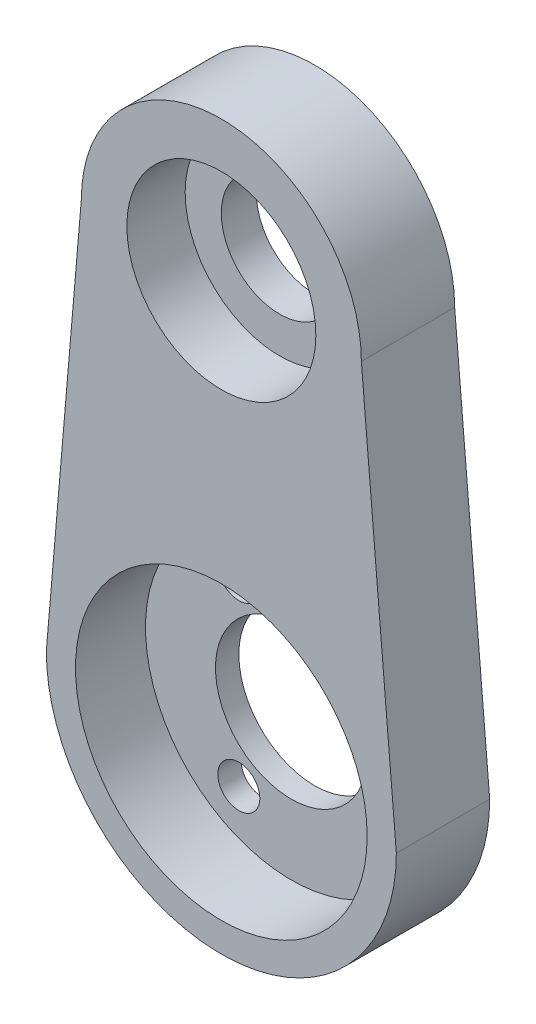
ISO-10303-21;
HEADER;
FILE_DESCRIPTION(('STEP AP214'),'2;1');
FILE_NAME('part.step','',(''),(''),'','','');
FILE_SCHEMA(('AUTOMOTIVE_DESIGN { 1 0 10303 214 1 1 1 1 }'));
ENDSEC;
DATA;
#1=APPLICATION_CONTEXT('core data for automotive mechanical design processes');
#2=APPLICATION_PROTOCOL_DEFINITION('international standard','automotive_design',2000,#1);
#3=PRODUCT_CONTEXT('',#1,'mechanical');
#4=PRODUCT('Part','Part','',(#3));
#5=PRODUCT_RELATED_PRODUCT_CATEGORY('part','',(#4));
#6=PRODUCT_DEFINITION_FORMATION('','',#4);
#7=PRODUCT_DEFINITION_CONTEXT('part definition',#1,'design');
#8=PRODUCT_DEFINITION('design','',#6,#7);
#9=PRODUCT_DEFINITION_SHAPE('','',#8);
#10=(LENGTH_UNIT() NAMED_UNIT(*) SI_UNIT(.MILLI.,.METRE.));
#11=(NAMED_UNIT(*) PLANE_ANGLE_UNIT() SI_UNIT($,.RADIAN.));
#12=(NAMED_UNIT(*) SI_UNIT($,.STERADIAN.) SOLID_ANGLE_UNIT());
#13=UNCERTAINTY_MEASURE_WITH_UNIT(LENGTH_MEASURE(1.E-05),#10,'distance_accuracy_value','');
#14=(GEOMETRIC_REPRESENTATION_CONTEXT(3) GLOBAL_UNCERTAINTY_ASSIGNED_CONTEXT((#13)) GLOBAL_UNIT_ASSIGNED_CONTEXT((#10,
#11,#12)) REPRESENTATION_CONTEXT('',''));
#15=CARTESIAN_POINT('',(0.,0.,0.));
#16=DIRECTION('',(0.,0.,1.));
#17=DIRECTION('',(1.,0.,0.));
#18=AXIS2_PLACEMENT_3D('',#15,#16,#17);
#19=CARTESIAN_POINT('',(0.,0.,-2.));
#20=DIRECTION('',(0.,0.,1.));
#21=DIRECTION('',(1.,0.,0.));
#22=AXIS2_PLACEMENT_3D('',#19,#20,#21);
#23=CYLINDRICAL_SURFACE('',#22,8.1);
#24=CARTESIAN_POINT('',(0.,0.,8.));
#25=DIRECTION('',(0.,0.,1.));
#26=DIRECTION('',(1.,0.,0.));
#27=AXIS2_PLACEMENT_3D('',#24,#25,#26);
#28=CIRCLE('',#27,8.1);
#29=CARTESIAN_POINT('',(8.1,0.,8.));
#30=VERTEX_POINT('',#29);
#31=EDGE_CURVE('E142',#30,#30,#28,.T.);
#32=ORIENTED_EDGE('',*,*,#31,.T.);
#33=EDGE_LOOP('',(#32));
#34=FACE_BOUND('',#33,.T.);
#35=CARTESIAN_POINT('',(0.,0.,3.));
#36=DIRECTION('',(0.,0.,-1.));
#37=DIRECTION('',(-1.,0.,0.));
#38=AXIS2_PLACEMENT_3D('',#35,#36,#37);
#39=CIRCLE('',#38,8.1);
#40=CARTESIAN_POINT('',(-8.1,0.,3.));
#41=VERTEX_POINT('',#40);
#42=EDGE_CURVE('E11',#41,#41,#39,.F.);
#43=ORIENTED_EDGE('',*,*,#42,.F.);
#44=EDGE_LOOP('',(#43));
#45=FACE_BOUND('',#44,.T.);
#46=ADVANCED_FACE('F39',(#34,#45),#23,.F.);
#47=CARTESIAN_POINT('',(0.,-35.,-2.));
#48=DIRECTION('',(0.,0.,1.));
#49=DIRECTION('',(1.,0.,0.));
#50=AXIS2_PLACEMENT_3D('',#47,#48,#49);
#51=CYLINDRICAL_SURFACE('',#50,6.5);
#52=CARTESIAN_POINT('',(0.,-35.,0.));
#53=DIRECTION('',(0.,0.,-1.));
#54=DIRECTION('',(-1.,0.,0.));
#55=AXIS2_PLACEMENT_3D('',#52,#53,#54);
#56=CIRCLE('',#55,6.5);
#57=CARTESIAN_POINT('',(-6.5,-35.,0.));
#58=VERTEX_POINT('',#57);
#59=EDGE_CURVE('E109',#58,#58,#56,.T.);
#60=ORIENTED_EDGE('',*,*,#59,.T.);
#61=EDGE_LOOP('',(#60));
#62=FACE_BOUND('',#61,.T.);
#63=CARTESIAN_POINT('',(0.,-35.,2.));
#64=DIRECTION('',(0.,0.,1.));
#65=DIRECTION('',(1.,0.,0.));
#66=AXIS2_PLACEMENT_3D('',#63,#64,#65);
#67=CIRCLE('',#66,6.5);
#68=CARTESIAN_POINT('',(6.5,-35.,2.));
#69=VERTEX_POINT('',#68);
#70=EDGE_CURVE('E123',#69,#69,#67,.F.);
#71=ORIENTED_EDGE('',*,*,#70,.F.);
#72=EDGE_LOOP('',(#71));
#73=FACE_BOUND('',#72,.T.);
#74=ADVANCED_FACE('F154',(#62,#73),#51,.F.);
#75=CARTESIAN_POINT('',(-4.49999999999991,-42.79422863406,-2.));
#76=DIRECTION('',(0.,0.,1.));
#77=DIRECTION('',(1.,0.,0.));
#78=AXIS2_PLACEMENT_3D('',#75,#76,#77);
#79=CYLINDRICAL_SURFACE('',#78,1.8);
#80=CARTESIAN_POINT('',(-4.49999999999991,-42.79422863406,0.));
#81=DIRECTION('',(0.,0.,-1.));
#82=DIRECTION('',(-1.,0.,0.));
#83=AXIS2_PLACEMENT_3D('',#80,#81,#82);
#84=CIRCLE('',#83,1.8);
#85=CARTESIAN_POINT('',(-6.29999999999991,-42.79422863406,0.));
#86=VERTEX_POINT('',#85);
#87=EDGE_CURVE('E119',#86,#86,#84,.T.);
#88=ORIENTED_EDGE('',*,*,#87,.T.);
#89=EDGE_LOOP('',(#88));
#90=FACE_BOUND('',#89,.T.);
#91=CARTESIAN_POINT('',(-4.49999999999991,-42.79422863406,2.));
#92=DIRECTION('',(0.,0.,1.));
#93=DIRECTION('',(1.,0.,0.));
#94=AXIS2_PLACEMENT_3D('',#91,#92,#93);
#95=CIRCLE('',#94,1.8);
#96=CARTESIAN_POINT('',(-2.69999999999991,-42.79422863406,2.));
#97=VERTEX_POINT('',#96);
#98=EDGE_CURVE('E134',#97,#97,#95,.F.);
#99=ORIENTED_EDGE('',*,*,#98,.F.);
#100=EDGE_LOOP('',(#99));
#101=FACE_BOUND('',#100,.T.);
#102=ADVANCED_FACE('F156',(#90,#101),#79,.F.);
#103=CARTESIAN_POINT('',(-4.50000000000004,-27.2057713659401,-2.));
#104=DIRECTION('',(0.,0.,1.));
#105=DIRECTION('',(1.,0.,0.));
#106=AXIS2_PLACEMENT_3D('',#103,#104,#105);
#107=CYLINDRICAL_SURFACE('',#106,1.8);
#108=CARTESIAN_POINT('',(-4.50000000000004,-27.2057713659401,0.));
#109=DIRECTION('',(0.,0.,-1.));
#110=DIRECTION('',(-1.,0.,0.));
#111=AXIS2_PLACEMENT_3D('',#108,#109,#110);
#112=CIRCLE('',#111,1.8);
#113=CARTESIAN_POINT('',(-6.30000000000004,-27.2057713659401,0.));
#114=VERTEX_POINT('',#113);
#115=EDGE_CURVE('E122',#114,#114,#112,.T.);
#116=ORIENTED_EDGE('',*,*,#115,.T.);
#117=EDGE_LOOP('',(#116));
#118=FACE_BOUND('',#117,.T.);
#119=CARTESIAN_POINT('',(-4.50000000000004,-27.2057713659401,2.));
#120=DIRECTION('',(0.,0.,1.));
#121=DIRECTION('',(1.,0.,0.));
#122=AXIS2_PLACEMENT_3D('',#119,#120,#121);
#123=CIRCLE('',#122,1.8);
#124=CARTESIAN_POINT('',(-2.70000000000004,-27.2057713659401,2.));
#125=VERTEX_POINT('',#124);
#126=EDGE_CURVE('E129',#125,#125,#123,.F.);
#127=ORIENTED_EDGE('',*,*,#126,.F.);
#128=EDGE_LOOP('',(#127));
#129=FACE_BOUND('',#128,.T.);
#130=ADVANCED_FACE('F163',(#118,#129),#107,.F.);
#131=CARTESIAN_POINT('',(9.,-35.,-2.));
#132=DIRECTION('',(0.,0.,1.));
#133=DIRECTION('',(1.,0.,0.));
#134=AXIS2_PLACEMENT_3D('',#131,#132,#133);
#135=CYLINDRICAL_SURFACE('',#134,1.8);
#136=CARTESIAN_POINT('',(9.,-35.,0.));
#137=DIRECTION('',(0.,0.,-1.));
#138=DIRECTION('',(-1.,0.,0.));
#139=AXIS2_PLACEMENT_3D('',#136,#137,#138);
#140=CIRCLE('',#139,1.8);
#141=CARTESIAN_POINT('',(7.2,-35.,0.));
#142=VERTEX_POINT('',#141);
#143=EDGE_CURVE('E118',#142,#142,#140,.T.);
#144=ORIENTED_EDGE('',*,*,#143,.T.);
#145=EDGE_LOOP('',(#144));
#146=FACE_BOUND('',#145,.T.);
#147=CARTESIAN_POINT('',(9.,-35.,2.));
#148=DIRECTION('',(0.,0.,1.));
#149=DIRECTION('',(1.,0.,0.));
#150=AXIS2_PLACEMENT_3D('',#147,#148,#149);
#151=CIRCLE('',#150,1.8);
#152=CARTESIAN_POINT('',(10.8,-35.,2.));
#153=VERTEX_POINT('',#152);
#154=EDGE_CURVE('E127',#153,#153,#151,.F.);
#155=ORIENTED_EDGE('',*,*,#154,.F.);
#156=EDGE_LOOP('',(#155));
#157=FACE_BOUND('',#156,.T.);
#158=ADVANCED_FACE('F185',(#146,#157),#135,.F.);
#159=CARTESIAN_POINT('',(0.,0.,8.));
#160=DIRECTION('',(0.,0.,-1.));
#161=DIRECTION('',(-1.,0.,0.));
#162=AXIS2_PLACEMENT_3D('',#159,#160,#161);
#163=CYLINDRICAL_SURFACE('',#162,12.);
#164=CARTESIAN_POINT('',(0.,0.,0.));
#165=DIRECTION('',(0.,0.,1.));
#166=DIRECTION('',(-1.,0.,0.));
#167=AXIS2_PLACEMENT_3D('',#164,#165,#166);
#168=CIRCLE('',#167,12.);
#169=CARTESIAN_POINT('',(12.,0.,0.));
#170=VERTEX_POINT('',#169);
#171=CARTESIAN_POINT('',(-12.,0.,0.));
#172=VERTEX_POINT('',#171);
#173=EDGE_CURVE('E106',#170,#172,#168,.T.);
#174=ORIENTED_EDGE('',*,*,#173,.T.);
#175=DIRECTION('',(0.,0.,-1.));
#176=VECTOR('',#175,1.);
#177=CARTESIAN_POINT('',(-12.,0.,8.));
#178=LINE('',#177,#176);
#179=CARTESIAN_POINT('',(-12.,0.,8.));
#180=VERTEX_POINT('',#179);
#181=EDGE_CURVE('E48',#180,#172,#178,.T.);
#182=ORIENTED_EDGE('',*,*,#181,.F.);
#183=CARTESIAN_POINT('',(0.,0.,8.));
#184=DIRECTION('',(0.,0.,1.));
#185=DIRECTION('',(-1.,0.,0.));
#186=AXIS2_PLACEMENT_3D('',#183,#184,#185);
#187=CIRCLE('',#186,12.);
#188=CARTESIAN_POINT('',(12.,0.,8.));
#189=VERTEX_POINT('',#188);
#190=EDGE_CURVE('E92',#189,#180,#187,.T.);
#191=ORIENTED_EDGE('',*,*,#190,.F.);
#192=DIRECTION('',(0.,0.,-1.));
#193=VECTOR('',#192,1.);
#194=CARTESIAN_POINT('',(12.,0.,8.));
#195=LINE('',#194,#193);
#196=EDGE_CURVE('E102',#189,#170,#195,.T.);
#197=ORIENTED_EDGE('',*,*,#196,.T.);
#198=EDGE_LOOP('',(#174,#182,#191,#197));
#199=FACE_BOUND('',#198,.T.);
#200=ADVANCED_FACE('F41',(#199),#163,.T.);
#201=CARTESIAN_POINT('',(-12.,0.,8.));
#202=DIRECTION('',(0.996346649041751,-0.0854011413464357,0.));
#203=DIRECTION('',(0.0854011413464357,0.996346649041751,0.));
#204=AXIS2_PLACEMENT_3D('',#201,#202,#203);
#205=PLANE('',#204);
#206=DIRECTION('',(-0.0854011413464357,-0.996346649041751,0.));
#207=VECTOR('',#206,1.);
#208=CARTESIAN_POINT('',(-12.,0.,0.));
#209=LINE('',#208,#207);
#210=CARTESIAN_POINT('',(-15.,-35.,0.));
#211=VERTEX_POINT('',#210);
#212=EDGE_CURVE('E97',#172,#211,#209,.T.);
#213=ORIENTED_EDGE('',*,*,#212,.T.);
#214=DIRECTION('',(0.,0.,-1.));
#215=VECTOR('',#214,1.);
#216=CARTESIAN_POINT('',(-15.,-35.,8.));
#217=LINE('',#216,#215);
#218=CARTESIAN_POINT('',(-15.,-35.,8.));
#219=VERTEX_POINT('',#218);
#220=EDGE_CURVE('E95',#219,#211,#217,.T.);
#221=ORIENTED_EDGE('',*,*,#220,.F.);
#222=DIRECTION('',(-0.0854011413464357,-0.996346649041751,0.));
#223=VECTOR('',#222,1.);
#224=CARTESIAN_POINT('',(-12.,0.,8.));
#225=LINE('',#224,#223);
#226=EDGE_CURVE('E87',#180,#219,#225,.T.);
#227=ORIENTED_EDGE('',*,*,#226,.F.);
#228=ORIENTED_EDGE('',*,*,#181,.T.);
#229=EDGE_LOOP('',(#213,#221,#227,#228));
#230=FACE_BOUND('',#229,.T.);
#231=ADVANCED_FACE('F96',(#230),#205,.F.);
#232=CARTESIAN_POINT('',(0.,-35.,8.));
#233=DIRECTION('',(0.,0.,-1.));
#234=DIRECTION('',(-1.,0.,0.));
#235=AXIS2_PLACEMENT_3D('',#232,#233,#234);
#236=CYLINDRICAL_SURFACE('',#235,15.);
#237=CARTESIAN_POINT('',(0.,-35.,0.));
#238=DIRECTION('',(0.,0.,1.));
#239=DIRECTION('',(1.,0.,0.));
#240=AXIS2_PLACEMENT_3D('',#237,#238,#239);
#241=CIRCLE('',#240,15.);
#242=CARTESIAN_POINT('',(15.,-35.,0.));
#243=VERTEX_POINT('',#242);
#244=EDGE_CURVE('E73',#211,#243,#241,.T.);
#245=ORIENTED_EDGE('',*,*,#244,.T.);
#246=DIRECTION('',(0.,0.,-1.));
#247=VECTOR('',#246,1.);
#248=CARTESIAN_POINT('',(15.,-35.,8.));
#249=LINE('',#248,#247);
#250=CARTESIAN_POINT('',(15.,-35.,8.));
#251=VERTEX_POINT('',#250);
#252=EDGE_CURVE('E98',#251,#243,#249,.T.);
#253=ORIENTED_EDGE('',*,*,#252,.F.);
#254=CARTESIAN_POINT('',(0.,-35.,8.));
#255=DIRECTION('',(0.,0.,1.));
#256=DIRECTION('',(1.,0.,0.));
#257=AXIS2_PLACEMENT_3D('',#254,#255,#256);
#258=CIRCLE('',#257,15.);
#259=EDGE_CURVE('E90',#219,#251,#258,.T.);
#260=ORIENTED_EDGE('',*,*,#259,.F.);
#261=ORIENTED_EDGE('',*,*,#220,.T.);
#262=EDGE_LOOP('',(#245,#253,#260,#261));
#263=FACE_BOUND('',#262,.T.);
#264=ADVANCED_FACE('F100',(#263),#236,.T.);
#265=CARTESIAN_POINT('',(12.,0.,8.));
#266=DIRECTION('',(-0.996346649041751,-0.0854011413464357,0.));
#267=DIRECTION('',(0.0854011413464357,-0.996346649041751,0.));
#268=AXIS2_PLACEMENT_3D('',#265,#266,#267);
#269=PLANE('',#268);
#270=DIRECTION('',(-0.0854011413464357,0.996346649041751,0.));
#271=VECTOR('',#270,1.);
#272=CARTESIAN_POINT('',(12.,0.,0.));
#273=LINE('',#272,#271);
#274=EDGE_CURVE('E79',#243,#170,#273,.T.);
#275=ORIENTED_EDGE('',*,*,#274,.T.);
#276=ORIENTED_EDGE('',*,*,#196,.F.);
#277=DIRECTION('',(-0.0854011413464357,0.996346649041751,0.));
#278=VECTOR('',#277,1.);
#279=CARTESIAN_POINT('',(12.,0.,8.));
#280=LINE('',#279,#278);
#281=EDGE_CURVE('E56',#251,#189,#280,.T.);
#282=ORIENTED_EDGE('',*,*,#281,.F.);
#283=ORIENTED_EDGE('',*,*,#252,.T.);
#284=EDGE_LOOP('',(#275,#276,#282,#283));
#285=FACE_BOUND('',#284,.T.);
#286=ADVANCED_FACE('F173',(#285),#269,.F.);
#287=CARTESIAN_POINT('',(0.,0.,8.));
#288=DIRECTION('',(0.,0.,-1.));
#289=DIRECTION('',(-1.,0.,0.));
#290=AXIS2_PLACEMENT_3D('',#287,#288,#289);
#291=PLANE('',#290);
#292=ORIENTED_EDGE('',*,*,#31,.F.);
#293=EDGE_LOOP('',(#292));
#294=FACE_BOUND('',#293,.T.);
#295=CARTESIAN_POINT('',(0.,-35.,8.));
#296=DIRECTION('',(0.,0.,1.));
#297=DIRECTION('',(1.,0.,0.));
#298=AXIS2_PLACEMENT_3D('',#295,#296,#297);
#299=CIRCLE('',#298,12.5);
#300=CARTESIAN_POINT('',(12.5,-35.,8.));
#301=VERTEX_POINT('',#300);
#302=EDGE_CURVE('E137',#301,#301,#299,.T.);
#303=ORIENTED_EDGE('',*,*,#302,.F.);
#304=EDGE_LOOP('',(#303));
#305=FACE_BOUND('',#304,.T.);
#306=ORIENTED_EDGE('',*,*,#190,.T.);
#307=ORIENTED_EDGE('',*,*,#226,.T.);
#308=ORIENTED_EDGE('',*,*,#259,.T.);
#309=ORIENTED_EDGE('',*,*,#281,.T.);
#310=EDGE_LOOP('',(#306,#307,#308,#309));
#311=FACE_BOUND('',#310,.T.);
#312=ADVANCED_FACE('F88',(#294,#305,#311),#291,.F.);
#313=CARTESIAN_POINT('',(0.,0.,0.));
#314=DIRECTION('',(0.,0.,-1.));
#315=DIRECTION('',(-1.,0.,0.));
#316=AXIS2_PLACEMENT_3D('',#313,#314,#315);
#317=PLANE('',#316);
#318=ORIENTED_EDGE('',*,*,#143,.F.);
#319=EDGE_LOOP('',(#318));
#320=FACE_BOUND('',#319,.T.);
#321=ORIENTED_EDGE('',*,*,#115,.F.);
#322=EDGE_LOOP('',(#321));
#323=FACE_BOUND('',#322,.T.);
#324=ORIENTED_EDGE('',*,*,#87,.F.);
#325=EDGE_LOOP('',(#324));
#326=FACE_BOUND('',#325,.T.);
#327=ORIENTED_EDGE('',*,*,#59,.F.);
#328=EDGE_LOOP('',(#327));
#329=FACE_BOUND('',#328,.T.);
#330=ORIENTED_EDGE('',*,*,#173,.F.);
#331=ORIENTED_EDGE('',*,*,#274,.F.);
#332=ORIENTED_EDGE('',*,*,#244,.F.);
#333=ORIENTED_EDGE('',*,*,#212,.F.);
#334=EDGE_LOOP('',(#330,#331,#332,#333));
#335=FACE_BOUND('',#334,.T.);
#336=CARTESIAN_POINT('',(0.,0.,0.));
#337=DIRECTION('',(0.,0.,-1.));
#338=DIRECTION('',(-1.,0.,0.));
#339=AXIS2_PLACEMENT_3D('',#336,#337,#338);
#340=CIRCLE('',#339,5.);
#341=CARTESIAN_POINT('',(-5.,0.,0.));
#342=VERTEX_POINT('',#341);
#343=EDGE_CURVE('E197',#342,#342,#340,.T.);
#344=ORIENTED_EDGE('',*,*,#343,.F.);
#345=EDGE_LOOP('',(#344));
#346=FACE_BOUND('',#345,.T.);
#347=ADVANCED_FACE('F172',(#320,#323,#326,#329,#335,#346),#317,.T.);
#348=CARTESIAN_POINT('',(0.,-35.,2.));
#349=DIRECTION('',(0.,0.,1.));
#350=DIRECTION('',(1.,0.,0.));
#351=AXIS2_PLACEMENT_3D('',#348,#349,#350);
#352=PLANE('',#351);
#353=CARTESIAN_POINT('',(0.,-35.,2.));
#354=DIRECTION('',(0.,0.,1.));
#355=DIRECTION('',(1.,0.,0.));
#356=AXIS2_PLACEMENT_3D('',#353,#354,#355);
#357=CIRCLE('',#356,12.5);
#358=CARTESIAN_POINT('',(12.5,-35.,2.));
#359=VERTEX_POINT('',#358);
#360=EDGE_CURVE('E130',#359,#359,#357,.T.);
#361=ORIENTED_EDGE('',*,*,#360,.T.);
#362=EDGE_LOOP('',(#361));
#363=FACE_BOUND('',#362,.T.);
#364=ORIENTED_EDGE('',*,*,#154,.T.);
#365=EDGE_LOOP('',(#364));
#366=FACE_BOUND('',#365,.T.);
#367=ORIENTED_EDGE('',*,*,#126,.T.);
#368=EDGE_LOOP('',(#367));
#369=FACE_BOUND('',#368,.T.);
#370=ORIENTED_EDGE('',*,*,#98,.T.);
#371=EDGE_LOOP('',(#370));
#372=FACE_BOUND('',#371,.T.);
#373=ORIENTED_EDGE('',*,*,#70,.T.);
#374=EDGE_LOOP('',(#373));
#375=FACE_BOUND('',#374,.T.);
#376=ADVANCED_FACE('F152',(#363,#366,#369,#372,#375),#352,.T.);
#377=CARTESIAN_POINT('',(0.,-35.,2.));
#378=DIRECTION('',(0.,0.,1.));
#379=DIRECTION('',(1.,0.,0.));
#380=AXIS2_PLACEMENT_3D('',#377,#378,#379);
#381=CYLINDRICAL_SURFACE('',#380,12.5);
#382=ORIENTED_EDGE('',*,*,#360,.F.);
#383=EDGE_LOOP('',(#382));
#384=FACE_BOUND('',#383,.T.);
#385=ORIENTED_EDGE('',*,*,#302,.T.);
#386=EDGE_LOOP('',(#385));
#387=FACE_BOUND('',#386,.T.);
#388=ADVANCED_FACE('F210',(#384,#387),#381,.F.);
#389=CARTESIAN_POINT('',(0.,0.,3.));
#390=DIRECTION('',(0.,0.,-1.));
#391=DIRECTION('',(-1.,0.,0.));
#392=AXIS2_PLACEMENT_3D('',#389,#390,#391);
#393=PLANE('',#392);
#394=CARTESIAN_POINT('',(0.,0.,3.));
#395=DIRECTION('',(0.,0.,-1.));
#396=DIRECTION('',(-1.,0.,0.));
#397=AXIS2_PLACEMENT_3D('',#394,#395,#396);
#398=CIRCLE('',#397,5.);
#399=CARTESIAN_POINT('',(-5.,0.,3.));
#400=VERTEX_POINT('',#399);
#401=EDGE_CURVE('E199',#400,#400,#398,.T.);
#402=ORIENTED_EDGE('',*,*,#401,.T.);
#403=EDGE_LOOP('',(#402));
#404=FACE_BOUND('',#403,.T.);
#405=ORIENTED_EDGE('',*,*,#42,.T.);
#406=EDGE_LOOP('',(#405));
#407=FACE_BOUND('',#406,.T.);
#408=ADVANCED_FACE('F212',(#404,#407),#393,.F.);
#409=CARTESIAN_POINT('',(0.,0.,3.));
#410=DIRECTION('',(0.,0.,-1.));
#411=DIRECTION('',(-1.,0.,0.));
#412=AXIS2_PLACEMENT_3D('',#409,#410,#411);
#413=CYLINDRICAL_SURFACE('',#412,5.);
#414=ORIENTED_EDGE('',*,*,#401,.F.);
#415=EDGE_LOOP('',(#414));
#416=FACE_BOUND('',#415,.T.);
#417=ORIENTED_EDGE('',*,*,#343,.T.);
#418=EDGE_LOOP('',(#417));
#419=FACE_BOUND('',#418,.T.);
#420=ADVANCED_FACE('F219',(#416,#419),#413,.F.);
#421=CLOSED_SHELL('',(#46,#74,#102,#130,#158,#200,#231,#264,#286,#312,#347,#376,#388,#408,#420));
#422=MANIFOLD_SOLID_BREP('B2',#421);
#423=ADVANCED_BREP_SHAPE_REPRESENTATION('',(#18,#422),#14);
#424=SHAPE_DEFINITION_REPRESENTATION(#9,#423);
ENDSEC;
END-ISO-10303-21;
